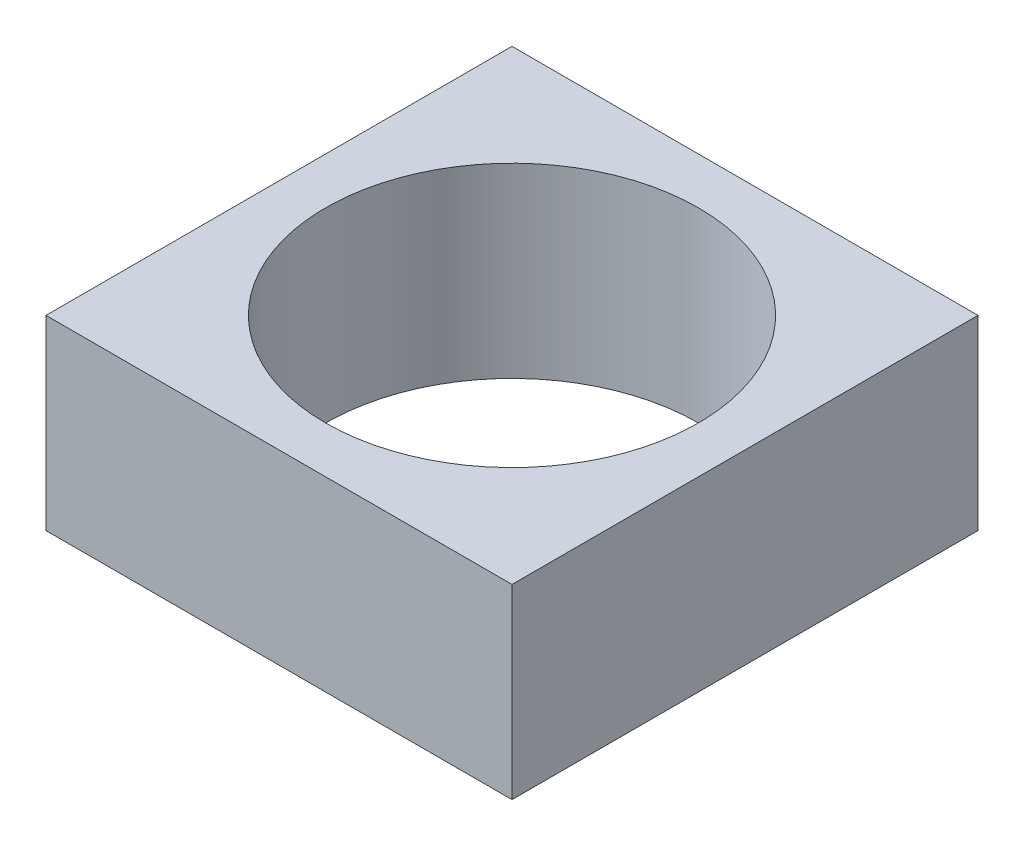
ISO-10303-21;
HEADER;
FILE_DESCRIPTION(('STEP AP214'),'2;1');
FILE_NAME('part.step','',(''),(''),'','','');
FILE_SCHEMA(('AUTOMOTIVE_DESIGN { 1 0 10303 214 1 1 1 1 }'));
ENDSEC;
DATA;
#1=APPLICATION_CONTEXT('core data for automotive mechanical design processes');
#2=APPLICATION_PROTOCOL_DEFINITION('international standard','automotive_design',2000,#1);
#3=PRODUCT_CONTEXT('',#1,'mechanical');
#4=PRODUCT('Part','Part','',(#3));
#5=PRODUCT_RELATED_PRODUCT_CATEGORY('part','',(#4));
#6=PRODUCT_DEFINITION_FORMATION('','',#4);
#7=PRODUCT_DEFINITION_CONTEXT('part definition',#1,'design');
#8=PRODUCT_DEFINITION('design','',#6,#7);
#9=PRODUCT_DEFINITION_SHAPE('','',#8);
#10=(LENGTH_UNIT() NAMED_UNIT(*) SI_UNIT(.MILLI.,.METRE.));
#11=(NAMED_UNIT(*) PLANE_ANGLE_UNIT() SI_UNIT($,.RADIAN.));
#12=(NAMED_UNIT(*) SI_UNIT($,.STERADIAN.) SOLID_ANGLE_UNIT());
#13=UNCERTAINTY_MEASURE_WITH_UNIT(LENGTH_MEASURE(1.E-05),#10,'distance_accuracy_value','');
#14=(GEOMETRIC_REPRESENTATION_CONTEXT(3) GLOBAL_UNCERTAINTY_ASSIGNED_CONTEXT((#13)) GLOBAL_UNIT_ASSIGNED_CONTEXT((#10,
#11,#12)) REPRESENTATION_CONTEXT('',''));
#15=CARTESIAN_POINT('',(0.,0.,0.));
#16=DIRECTION('',(0.,0.,1.));
#17=DIRECTION('',(1.,0.,0.));
#18=AXIS2_PLACEMENT_3D('',#15,#16,#17);
#19=CARTESIAN_POINT('',(0.,20.,0.));
#20=DIRECTION('',(0.,-1.,0.));
#21=DIRECTION('',(0.,0.,-1.));
#22=AXIS2_PLACEMENT_3D('',#19,#20,#21);
#23=PLANE('',#22);
#24=DIRECTION('',(0.,0.,-1.));
#25=VECTOR('',#24,1.);
#26=CARTESIAN_POINT('',(25.,20.,25.));
#27=LINE('',#26,#25);
#28=CARTESIAN_POINT('',(25.,20.,25.));
#29=VERTEX_POINT('',#28);
#30=CARTESIAN_POINT('',(25.,20.,-25.));
#31=VERTEX_POINT('',#30);
#32=EDGE_CURVE('E85',#29,#31,#27,.T.);
#33=ORIENTED_EDGE('',*,*,#32,.T.);
#34=DIRECTION('',(-1.,0.,0.));
#35=VECTOR('',#34,1.);
#36=CARTESIAN_POINT('',(-25.,20.,-25.));
#37=LINE('',#36,#35);
#38=CARTESIAN_POINT('',(-25.,20.,-25.));
#39=VERTEX_POINT('',#38);
#40=EDGE_CURVE('E80',#31,#39,#37,.T.);
#41=ORIENTED_EDGE('',*,*,#40,.T.);
#42=DIRECTION('',(0.,0.,1.));
#43=VECTOR('',#42,1.);
#44=CARTESIAN_POINT('',(-25.,20.,25.));
#45=LINE('',#44,#43);
#46=CARTESIAN_POINT('',(-25.,20.,25.));
#47=VERTEX_POINT('',#46);
#48=EDGE_CURVE('E83',#39,#47,#45,.T.);
#49=ORIENTED_EDGE('',*,*,#48,.T.);
#50=DIRECTION('',(1.,0.,0.));
#51=VECTOR('',#50,1.);
#52=CARTESIAN_POINT('',(-25.,20.,25.));
#53=LINE('',#52,#51);
#54=EDGE_CURVE('E50',#47,#29,#53,.T.);
#55=ORIENTED_EDGE('',*,*,#54,.T.);
#56=EDGE_LOOP('',(#33,#41,#49,#55));
#57=FACE_BOUND('',#56,.T.);
#58=CARTESIAN_POINT('',(0.,20.,0.));
#59=DIRECTION('',(0.,1.,0.));
#60=DIRECTION('',(0.,0.,1.));
#61=AXIS2_PLACEMENT_3D('',#58,#59,#60);
#62=CIRCLE('',#61,20.);
#63=CARTESIAN_POINT('',(0.,20.,20.));
#64=VERTEX_POINT('',#63);
#65=EDGE_CURVE('E100',#64,#64,#62,.T.);
#66=ORIENTED_EDGE('',*,*,#65,.F.);
#67=EDGE_LOOP('',(#66));
#68=FACE_BOUND('',#67,.T.);
#69=ADVANCED_FACE('F33',(#57,#68),#23,.F.);
#70=CARTESIAN_POINT('',(0.,0.,0.));
#71=DIRECTION('',(0.,-1.,0.));
#72=DIRECTION('',(0.,0.,-1.));
#73=AXIS2_PLACEMENT_3D('',#70,#71,#72);
#74=PLANE('',#73);
#75=DIRECTION('',(0.,0.,-1.));
#76=VECTOR('',#75,1.);
#77=CARTESIAN_POINT('',(25.,0.,25.));
#78=LINE('',#77,#76);
#79=CARTESIAN_POINT('',(25.,0.,25.));
#80=VERTEX_POINT('',#79);
#81=CARTESIAN_POINT('',(25.,0.,-25.));
#82=VERTEX_POINT('',#81);
#83=EDGE_CURVE('E97',#80,#82,#78,.T.);
#84=ORIENTED_EDGE('',*,*,#83,.F.);
#85=DIRECTION('',(1.,0.,0.));
#86=VECTOR('',#85,1.);
#87=CARTESIAN_POINT('',(-25.,0.,25.));
#88=LINE('',#87,#86);
#89=CARTESIAN_POINT('',(-25.,0.,25.));
#90=VERTEX_POINT('',#89);
#91=EDGE_CURVE('E73',#90,#80,#88,.T.);
#92=ORIENTED_EDGE('',*,*,#91,.F.);
#93=DIRECTION('',(0.,0.,1.));
#94=VECTOR('',#93,1.);
#95=CARTESIAN_POINT('',(-25.,0.,25.));
#96=LINE('',#95,#94);
#97=CARTESIAN_POINT('',(-25.,0.,-25.));
#98=VERTEX_POINT('',#97);
#99=EDGE_CURVE('E67',#98,#90,#96,.T.);
#100=ORIENTED_EDGE('',*,*,#99,.F.);
#101=DIRECTION('',(-1.,0.,0.));
#102=VECTOR('',#101,1.);
#103=CARTESIAN_POINT('',(-25.,0.,-25.));
#104=LINE('',#103,#102);
#105=EDGE_CURVE('E89',#82,#98,#104,.T.);
#106=ORIENTED_EDGE('',*,*,#105,.F.);
#107=EDGE_LOOP('',(#84,#92,#100,#106));
#108=FACE_BOUND('',#107,.T.);
#109=CARTESIAN_POINT('',(0.,0.,0.));
#110=DIRECTION('',(0.,1.,0.));
#111=DIRECTION('',(0.,0.,1.));
#112=AXIS2_PLACEMENT_3D('',#109,#110,#111);
#113=CIRCLE('',#112,20.);
#114=CARTESIAN_POINT('',(0.,0.,20.));
#115=VERTEX_POINT('',#114);
#116=EDGE_CURVE('E112',#115,#115,#113,.T.);
#117=ORIENTED_EDGE('',*,*,#116,.T.);
#118=EDGE_LOOP('',(#117));
#119=FACE_BOUND('',#118,.T.);
#120=ADVANCED_FACE('F108',(#108,#119),#74,.T.);
#121=CARTESIAN_POINT('',(25.,20.,25.));
#122=DIRECTION('',(-1.,0.,0.));
#123=DIRECTION('',(0.,0.,1.));
#124=AXIS2_PLACEMENT_3D('',#121,#122,#123);
#125=PLANE('',#124);
#126=ORIENTED_EDGE('',*,*,#83,.T.);
#127=DIRECTION('',(0.,-1.,0.));
#128=VECTOR('',#127,1.);
#129=CARTESIAN_POINT('',(25.,20.,-25.));
#130=LINE('',#129,#128);
#131=EDGE_CURVE('E11',#31,#82,#130,.T.);
#132=ORIENTED_EDGE('',*,*,#131,.F.);
#133=ORIENTED_EDGE('',*,*,#32,.F.);
#134=DIRECTION('',(0.,-1.,0.));
#135=VECTOR('',#134,1.);
#136=CARTESIAN_POINT('',(25.,20.,25.));
#137=LINE('',#136,#135);
#138=EDGE_CURVE('E93',#29,#80,#137,.T.);
#139=ORIENTED_EDGE('',*,*,#138,.T.);
#140=EDGE_LOOP('',(#126,#132,#133,#139));
#141=FACE_BOUND('',#140,.T.);
#142=ADVANCED_FACE('F35',(#141),#125,.F.);
#143=CARTESIAN_POINT('',(-25.,20.,-25.));
#144=DIRECTION('',(0.,0.,1.));
#145=DIRECTION('',(1.,0.,0.));
#146=AXIS2_PLACEMENT_3D('',#143,#144,#145);
#147=PLANE('',#146);
#148=ORIENTED_EDGE('',*,*,#105,.T.);
#149=DIRECTION('',(0.,-1.,0.));
#150=VECTOR('',#149,1.);
#151=CARTESIAN_POINT('',(-25.,20.,-25.));
#152=LINE('',#151,#150);
#153=EDGE_CURVE('E42',#39,#98,#152,.T.);
#154=ORIENTED_EDGE('',*,*,#153,.F.);
#155=ORIENTED_EDGE('',*,*,#40,.F.);
#156=ORIENTED_EDGE('',*,*,#131,.T.);
#157=EDGE_LOOP('',(#148,#154,#155,#156));
#158=FACE_BOUND('',#157,.T.);
#159=ADVANCED_FACE('F88',(#158),#147,.F.);
#160=CARTESIAN_POINT('',(-25.,20.,25.));
#161=DIRECTION('',(1.,0.,0.));
#162=DIRECTION('',(0.,0.,-1.));
#163=AXIS2_PLACEMENT_3D('',#160,#161,#162);
#164=PLANE('',#163);
#165=ORIENTED_EDGE('',*,*,#99,.T.);
#166=DIRECTION('',(0.,-1.,0.));
#167=VECTOR('',#166,1.);
#168=CARTESIAN_POINT('',(-25.,20.,25.));
#169=LINE('',#168,#167);
#170=EDGE_CURVE('E90',#47,#90,#169,.T.);
#171=ORIENTED_EDGE('',*,*,#170,.F.);
#172=ORIENTED_EDGE('',*,*,#48,.F.);
#173=ORIENTED_EDGE('',*,*,#153,.T.);
#174=EDGE_LOOP('',(#165,#171,#172,#173));
#175=FACE_BOUND('',#174,.T.);
#176=ADVANCED_FACE('F91',(#175),#164,.F.);
#177=CARTESIAN_POINT('',(-25.,20.,25.));
#178=DIRECTION('',(0.,0.,-1.));
#179=DIRECTION('',(-1.,0.,0.));
#180=AXIS2_PLACEMENT_3D('',#177,#178,#179);
#181=PLANE('',#180);
#182=ORIENTED_EDGE('',*,*,#91,.T.);
#183=ORIENTED_EDGE('',*,*,#138,.F.);
#184=ORIENTED_EDGE('',*,*,#54,.F.);
#185=ORIENTED_EDGE('',*,*,#170,.T.);
#186=EDGE_LOOP('',(#182,#183,#184,#185));
#187=FACE_BOUND('',#186,.T.);
#188=ADVANCED_FACE('F105',(#187),#181,.F.);
#189=CARTESIAN_POINT('',(0.,20.,0.));
#190=DIRECTION('',(0.,-1.,0.));
#191=DIRECTION('',(0.,0.,-1.));
#192=AXIS2_PLACEMENT_3D('',#189,#190,#191);
#193=CYLINDRICAL_SURFACE('',#192,20.);
#194=ORIENTED_EDGE('',*,*,#65,.T.);
#195=EDGE_LOOP('',(#194));
#196=FACE_BOUND('',#195,.T.);
#197=ORIENTED_EDGE('',*,*,#116,.F.);
#198=EDGE_LOOP('',(#197));
#199=FACE_BOUND('',#198,.T.);
#200=ADVANCED_FACE('F118',(#196,#199),#193,.F.);
#201=CLOSED_SHELL('',(#69,#120,#142,#159,#176,#188,#200));
#202=MANIFOLD_SOLID_BREP('B2',#201);
#203=ADVANCED_BREP_SHAPE_REPRESENTATION('',(#18,#202),#14);
#204=SHAPE_DEFINITION_REPRESENTATION(#9,#203);
ENDSEC;
END-ISO-10303-21;
